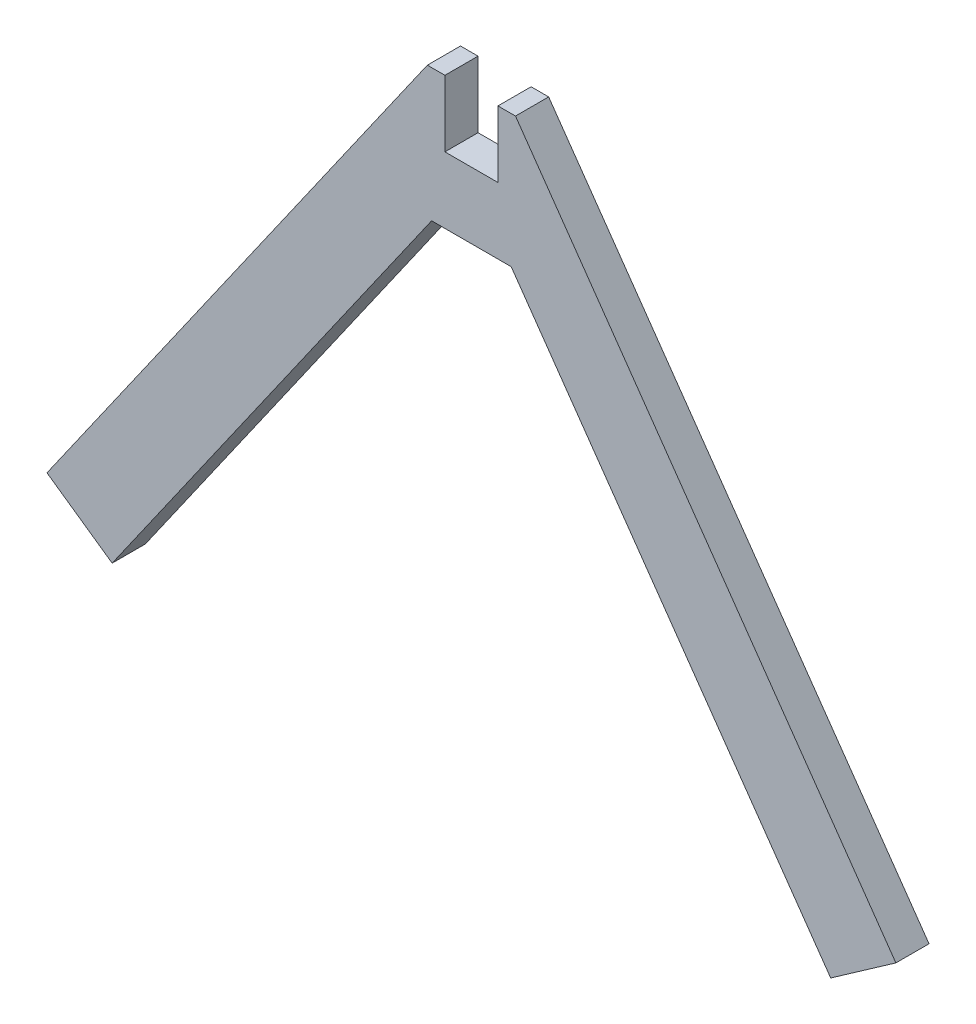
ISO-10303-21;
HEADER;
FILE_DESCRIPTION(('STEP AP214'),'2;1');
FILE_NAME('part.step','',(''),(''),'','','');
FILE_SCHEMA(('AUTOMOTIVE_DESIGN { 1 0 10303 214 1 1 1 1 }'));
ENDSEC;
DATA;
#1=APPLICATION_CONTEXT('core data for automotive mechanical design processes');
#2=APPLICATION_PROTOCOL_DEFINITION('international standard','automotive_design',2000,#1);
#3=PRODUCT_CONTEXT('',#1,'mechanical');
#4=PRODUCT('Part','Part','',(#3));
#5=PRODUCT_RELATED_PRODUCT_CATEGORY('part','',(#4));
#6=PRODUCT_DEFINITION_FORMATION('','',#4);
#7=PRODUCT_DEFINITION_CONTEXT('part definition',#1,'design');
#8=PRODUCT_DEFINITION('design','',#6,#7);
#9=PRODUCT_DEFINITION_SHAPE('','',#8);
#10=(LENGTH_UNIT() NAMED_UNIT(*) SI_UNIT(.MILLI.,.METRE.));
#11=(NAMED_UNIT(*) PLANE_ANGLE_UNIT() SI_UNIT($,.RADIAN.));
#12=(NAMED_UNIT(*) SI_UNIT($,.STERADIAN.) SOLID_ANGLE_UNIT());
#13=UNCERTAINTY_MEASURE_WITH_UNIT(LENGTH_MEASURE(1.E-05),#10,'distance_accuracy_value','');
#14=(GEOMETRIC_REPRESENTATION_CONTEXT(3) GLOBAL_UNCERTAINTY_ASSIGNED_CONTEXT((#13)) GLOBAL_UNIT_ASSIGNED_CONTEXT((#10,
#11,#12)) REPRESENTATION_CONTEXT('',''));
#15=CARTESIAN_POINT('',(0.,0.,0.));
#16=DIRECTION('',(0.,0.,1.));
#17=DIRECTION('',(1.,0.,0.));
#18=AXIS2_PLACEMENT_3D('',#15,#16,#17);
#19=CARTESIAN_POINT('',(4.21966663109892,0.,3.175));
#20=DIRECTION('',(0.,-1.,0.));
#21=DIRECTION('',(1.,0.,0.));
#22=AXIS2_PLACEMENT_3D('',#19,#20,#21);
#23=PLANE('',#22);
#24=DIRECTION('',(-1.,0.,0.));
#25=VECTOR('',#24,1.);
#26=CARTESIAN_POINT('',(4.21966663109892,0.,0.));
#27=LINE('',#26,#25);
#28=CARTESIAN_POINT('',(4.21966663109892,0.,0.));
#29=VERTEX_POINT('',#28);
#30=CARTESIAN_POINT('',(2.54,0.,0.));
#31=VERTEX_POINT('',#30);
#32=EDGE_CURVE('E154',#29,#31,#27,.T.);
#33=ORIENTED_EDGE('',*,*,#32,.T.);
#34=DIRECTION('',(0.,0.,1.));
#35=VECTOR('',#34,1.);
#36=CARTESIAN_POINT('',(2.54,0.,-0.00100000000000013));
#37=LINE('',#36,#35);
#38=CARTESIAN_POINT('',(2.54,0.,3.175));
#39=VERTEX_POINT('',#38);
#40=EDGE_CURVE('E192',#31,#39,#37,.T.);
#41=ORIENTED_EDGE('',*,*,#40,.T.);
#42=DIRECTION('',(-1.,0.,0.));
#43=VECTOR('',#42,1.);
#44=CARTESIAN_POINT('',(4.21966663109892,0.,3.175));
#45=LINE('',#44,#43);
#46=CARTESIAN_POINT('',(4.21966663109892,0.,3.175));
#47=VERTEX_POINT('',#46);
#48=EDGE_CURVE('E238',#47,#39,#45,.T.);
#49=ORIENTED_EDGE('',*,*,#48,.F.);
#50=DIRECTION('',(0.,0.,-1.));
#51=VECTOR('',#50,1.);
#52=CARTESIAN_POINT('',(4.21966663109892,0.,3.175));
#53=LINE('',#52,#51);
#54=EDGE_CURVE('E170',#47,#29,#53,.T.);
#55=ORIENTED_EDGE('',*,*,#54,.T.);
#56=EDGE_LOOP('',(#33,#41,#49,#55));
#57=FACE_BOUND('',#56,.T.);
#58=ADVANCED_FACE('F36',(#57),#23,.F.);
#59=CARTESIAN_POINT('',(34.3998317619085,-56.3868072573458,3.175));
#60=DIRECTION('',(0.819152044288989,0.57357643635105,0.));
#61=DIRECTION('',(-0.57357643635105,0.819152044288989,0.));
#62=AXIS2_PLACEMENT_3D('',#59,#60,#61);
#63=PLANE('',#62);
#64=DIRECTION('',(0.57357643635105,-0.819152044288989,0.));
#65=VECTOR('',#64,1.);
#66=CARTESIAN_POINT('',(34.3998317619085,-56.3868072573458,0.));
#67=LINE('',#66,#65);
#68=CARTESIAN_POINT('',(3.81000000000001,-12.7,0.));
#69=VERTEX_POINT('',#68);
#70=CARTESIAN_POINT('',(34.3998317619085,-56.3868072573458,0.));
#71=VERTEX_POINT('',#70);
#72=EDGE_CURVE('E145',#69,#71,#67,.T.);
#73=ORIENTED_EDGE('',*,*,#72,.T.);
#74=DIRECTION('',(0.,0.,-1.));
#75=VECTOR('',#74,1.);
#76=CARTESIAN_POINT('',(34.3998317619085,-56.3868072573458,3.175));
#77=LINE('',#76,#75);
#78=CARTESIAN_POINT('',(34.3998317619085,-56.3868072573458,3.175));
#79=VERTEX_POINT('',#78);
#80=EDGE_CURVE('E11',#79,#71,#77,.T.);
#81=ORIENTED_EDGE('',*,*,#80,.F.);
#82=DIRECTION('',(0.57357643635105,-0.819152044288989,0.));
#83=VECTOR('',#82,1.);
#84=CARTESIAN_POINT('',(34.3998317619085,-56.3868072573458,3.175));
#85=LINE('',#84,#83);
#86=CARTESIAN_POINT('',(3.81000000000001,-12.7,3.175));
#87=VERTEX_POINT('',#86);
#88=EDGE_CURVE('E163',#87,#79,#85,.T.);
#89=ORIENTED_EDGE('',*,*,#88,.F.);
#90=DIRECTION('',(0.,0.,-1.));
#91=VECTOR('',#90,1.);
#92=CARTESIAN_POINT('',(3.81000000000001,-12.7,3.175));
#93=LINE('',#92,#91);
#94=EDGE_CURVE('E141',#87,#69,#93,.T.);
#95=ORIENTED_EDGE('',*,*,#94,.T.);
#96=EDGE_LOOP('',(#73,#81,#89,#95));
#97=FACE_BOUND('',#96,.T.);
#98=ADVANCED_FACE('F38',(#97),#63,.F.);
#99=CARTESIAN_POINT('',(40.6417703393906,-52.0161548123508,3.175));
#100=DIRECTION('',(-0.57357643635105,0.819152044288989,0.));
#101=DIRECTION('',(-0.819152044288989,-0.57357643635105,0.));
#102=AXIS2_PLACEMENT_3D('',#99,#100,#101);
#103=PLANE('',#102);
#104=DIRECTION('',(0.819152044288989,0.57357643635105,0.));
#105=VECTOR('',#104,1.);
#106=CARTESIAN_POINT('',(40.6417703393906,-52.0161548123508,0.));
#107=LINE('',#106,#105);
#108=CARTESIAN_POINT('',(40.6417703393906,-52.0161548123508,0.));
#109=VERTEX_POINT('',#108);
#110=EDGE_CURVE('E148',#71,#109,#107,.T.);
#111=ORIENTED_EDGE('',*,*,#110,.T.);
#112=DIRECTION('',(0.,0.,-1.));
#113=VECTOR('',#112,1.);
#114=CARTESIAN_POINT('',(40.6417703393906,-52.0161548123508,3.175));
#115=LINE('',#114,#113);
#116=CARTESIAN_POINT('',(40.6417703393906,-52.0161548123508,3.175));
#117=VERTEX_POINT('',#116);
#118=EDGE_CURVE('E44',#117,#109,#115,.T.);
#119=ORIENTED_EDGE('',*,*,#118,.F.);
#120=DIRECTION('',(0.819152044288989,0.57357643635105,0.));
#121=VECTOR('',#120,1.);
#122=CARTESIAN_POINT('',(40.6417703393906,-52.0161548123508,3.175));
#123=LINE('',#122,#121);
#124=EDGE_CURVE('E101',#79,#117,#123,.T.);
#125=ORIENTED_EDGE('',*,*,#124,.F.);
#126=ORIENTED_EDGE('',*,*,#80,.T.);
#127=EDGE_LOOP('',(#111,#119,#125,#126));
#128=FACE_BOUND('',#127,.T.);
#129=ADVANCED_FACE('F251',(#128),#103,.F.);
#130=CARTESIAN_POINT('',(4.21966663109892,0.,3.175));
#131=DIRECTION('',(-0.819152044288989,-0.57357643635105,0.));
#132=DIRECTION('',(0.57357643635105,-0.819152044288989,0.));
#133=AXIS2_PLACEMENT_3D('',#130,#131,#132);
#134=PLANE('',#133);
#135=DIRECTION('',(-0.57357643635105,0.819152044288989,0.));
#136=VECTOR('',#135,1.);
#137=CARTESIAN_POINT('',(4.21966663109892,0.,0.));
#138=LINE('',#137,#136);
#139=EDGE_CURVE('E151',#109,#29,#138,.T.);
#140=ORIENTED_EDGE('',*,*,#139,.T.);
#141=ORIENTED_EDGE('',*,*,#54,.F.);
#142=DIRECTION('',(-0.57357643635105,0.819152044288989,0.));
#143=VECTOR('',#142,1.);
#144=CARTESIAN_POINT('',(4.21966663109892,0.,3.175));
#145=LINE('',#144,#143);
#146=EDGE_CURVE('E178',#117,#47,#145,.T.);
#147=ORIENTED_EDGE('',*,*,#146,.F.);
#148=ORIENTED_EDGE('',*,*,#118,.T.);
#149=EDGE_LOOP('',(#140,#141,#147,#148));
#150=FACE_BOUND('',#149,.T.);
#151=ADVANCED_FACE('F176',(#150),#134,.F.);
#152=CARTESIAN_POINT('',(-2.54,0.,3.175));
#153=VERTEX_POINT('',#152);
#154=CARTESIAN_POINT('',(-4.21966663109891,0.,3.175));
#155=VERTEX_POINT('',#154);
#156=EDGE_CURVE('E237',#153,#155,#45,.T.);
#157=ORIENTED_EDGE('',*,*,#156,.F.);
#158=DIRECTION('',(0.,0.,1.));
#159=VECTOR('',#158,1.);
#160=CARTESIAN_POINT('',(-2.54,0.,-0.00100000000000013));
#161=LINE('',#160,#159);
#162=CARTESIAN_POINT('',(-2.54,0.,0.));
#163=VERTEX_POINT('',#162);
#164=EDGE_CURVE('E231',#163,#153,#161,.T.);
#165=ORIENTED_EDGE('',*,*,#164,.F.);
#166=CARTESIAN_POINT('',(-4.21966663109891,0.,0.));
#167=VERTEX_POINT('',#166);
#168=EDGE_CURVE('E153',#163,#167,#27,.T.);
#169=ORIENTED_EDGE('',*,*,#168,.T.);
#170=DIRECTION('',(0.,0.,-1.));
#171=VECTOR('',#170,1.);
#172=CARTESIAN_POINT('',(-4.21966663109891,0.,3.175));
#173=LINE('',#172,#171);
#174=EDGE_CURVE('E167',#155,#167,#173,.T.);
#175=ORIENTED_EDGE('',*,*,#174,.F.);
#176=EDGE_LOOP('',(#157,#165,#169,#175));
#177=FACE_BOUND('',#176,.T.);
#178=ADVANCED_FACE('F243',(#177),#23,.F.);
#179=CARTESIAN_POINT('',(-4.21966663109891,0.,3.175));
#180=DIRECTION('',(0.819152044288989,-0.57357643635105,0.));
#181=DIRECTION('',(0.57357643635105,0.819152044288989,0.));
#182=AXIS2_PLACEMENT_3D('',#179,#180,#181);
#183=PLANE('',#182);
#184=DIRECTION('',(-0.57357643635105,-0.819152044288989,0.));
#185=VECTOR('',#184,1.);
#186=CARTESIAN_POINT('',(-4.21966663109891,0.,0.));
#187=LINE('',#186,#185);
#188=CARTESIAN_POINT('',(-40.6417703393906,-52.0161548123508,0.));
#189=VERTEX_POINT('',#188);
#190=EDGE_CURVE('E157',#167,#189,#187,.T.);
#191=ORIENTED_EDGE('',*,*,#190,.T.);
#192=DIRECTION('',(0.,0.,-1.));
#193=VECTOR('',#192,1.);
#194=CARTESIAN_POINT('',(-40.6417703393906,-52.0161548123508,3.175));
#195=LINE('',#194,#193);
#196=CARTESIAN_POINT('',(-40.6417703393906,-52.0161548123508,3.175));
#197=VERTEX_POINT('',#196);
#198=EDGE_CURVE('E136',#197,#189,#195,.T.);
#199=ORIENTED_EDGE('',*,*,#198,.F.);
#200=DIRECTION('',(-0.57357643635105,-0.819152044288989,0.));
#201=VECTOR('',#200,1.);
#202=CARTESIAN_POINT('',(-4.21966663109891,0.,3.175));
#203=LINE('',#202,#201);
#204=EDGE_CURVE('E124',#155,#197,#203,.T.);
#205=ORIENTED_EDGE('',*,*,#204,.F.);
#206=ORIENTED_EDGE('',*,*,#174,.T.);
#207=EDGE_LOOP('',(#191,#199,#205,#206));
#208=FACE_BOUND('',#207,.T.);
#209=ADVANCED_FACE('F246',(#208),#183,.F.);
#210=CARTESIAN_POINT('',(-40.6417703393906,-52.0161548123508,3.175));
#211=DIRECTION('',(0.57357643635105,0.819152044288989,0.));
#212=DIRECTION('',(-0.819152044288989,0.57357643635105,0.));
#213=AXIS2_PLACEMENT_3D('',#210,#211,#212);
#214=PLANE('',#213);
#215=DIRECTION('',(0.819152044288989,-0.57357643635105,0.));
#216=VECTOR('',#215,1.);
#217=CARTESIAN_POINT('',(-40.6417703393906,-52.0161548123508,0.));
#218=LINE('',#217,#216);
#219=CARTESIAN_POINT('',(-34.3998317619085,-56.3868072573458,0.));
#220=VERTEX_POINT('',#219);
#221=EDGE_CURVE('E133',#189,#220,#218,.T.);
#222=ORIENTED_EDGE('',*,*,#221,.T.);
#223=DIRECTION('',(0.,0.,-1.));
#224=VECTOR('',#223,1.);
#225=CARTESIAN_POINT('',(-34.3998317619085,-56.3868072573458,3.175));
#226=LINE('',#225,#224);
#227=CARTESIAN_POINT('',(-34.3998317619085,-56.3868072573458,3.175));
#228=VERTEX_POINT('',#227);
#229=EDGE_CURVE('E130',#228,#220,#226,.T.);
#230=ORIENTED_EDGE('',*,*,#229,.F.);
#231=DIRECTION('',(0.819152044288989,-0.57357643635105,0.));
#232=VECTOR('',#231,1.);
#233=CARTESIAN_POINT('',(-40.6417703393906,-52.0161548123508,3.175));
#234=LINE('',#233,#232);
#235=EDGE_CURVE('E116',#197,#228,#234,.T.);
#236=ORIENTED_EDGE('',*,*,#235,.F.);
#237=ORIENTED_EDGE('',*,*,#198,.T.);
#238=EDGE_LOOP('',(#222,#230,#236,#237));
#239=FACE_BOUND('',#238,.T.);
#240=ADVANCED_FACE('F131',(#239),#214,.F.);
#241=CARTESIAN_POINT('',(-34.3998317619085,-56.3868072573458,3.175));
#242=DIRECTION('',(-0.819152044288989,0.57357643635105,0.));
#243=DIRECTION('',(-0.57357643635105,-0.819152044288989,0.));
#244=AXIS2_PLACEMENT_3D('',#241,#242,#243);
#245=PLANE('',#244);
#246=DIRECTION('',(0.57357643635105,0.819152044288989,0.));
#247=VECTOR('',#246,1.);
#248=CARTESIAN_POINT('',(-34.3998317619085,-56.3868072573458,0.));
#249=LINE('',#248,#247);
#250=CARTESIAN_POINT('',(-3.80999999999999,-12.7,0.));
#251=VERTEX_POINT('',#250);
#252=EDGE_CURVE('E160',#220,#251,#249,.T.);
#253=ORIENTED_EDGE('',*,*,#252,.T.);
#254=DIRECTION('',(0.,0.,-1.));
#255=VECTOR('',#254,1.);
#256=CARTESIAN_POINT('',(-3.80999999999999,-12.7,3.175));
#257=LINE('',#256,#255);
#258=CARTESIAN_POINT('',(-3.80999999999999,-12.7,3.175));
#259=VERTEX_POINT('',#258);
#260=EDGE_CURVE('E137',#259,#251,#257,.T.);
#261=ORIENTED_EDGE('',*,*,#260,.F.);
#262=DIRECTION('',(0.57357643635105,0.819152044288989,0.));
#263=VECTOR('',#262,1.);
#264=CARTESIAN_POINT('',(-34.3998317619085,-56.3868072573458,3.175));
#265=LINE('',#264,#263);
#266=EDGE_CURVE('E121',#228,#259,#265,.T.);
#267=ORIENTED_EDGE('',*,*,#266,.F.);
#268=ORIENTED_EDGE('',*,*,#229,.T.);
#269=EDGE_LOOP('',(#253,#261,#267,#268));
#270=FACE_BOUND('',#269,.T.);
#271=ADVANCED_FACE('F139',(#270),#245,.F.);
#272=CARTESIAN_POINT('',(-3.80999999999999,-12.7,3.175));
#273=DIRECTION('',(0.,1.,0.));
#274=DIRECTION('',(-1.,0.,0.));
#275=AXIS2_PLACEMENT_3D('',#272,#273,#274);
#276=PLANE('',#275);
#277=DIRECTION('',(1.,0.,0.));
#278=VECTOR('',#277,1.);
#279=CARTESIAN_POINT('',(-3.80999999999999,-12.7,0.));
#280=LINE('',#279,#278);
#281=EDGE_CURVE('E93',#251,#69,#280,.T.);
#282=ORIENTED_EDGE('',*,*,#281,.T.);
#283=ORIENTED_EDGE('',*,*,#94,.F.);
#284=DIRECTION('',(1.,0.,0.));
#285=VECTOR('',#284,1.);
#286=CARTESIAN_POINT('',(-3.80999999999999,-12.7,3.175));
#287=LINE('',#286,#285);
#288=EDGE_CURVE('E60',#259,#87,#287,.T.);
#289=ORIENTED_EDGE('',*,*,#288,.F.);
#290=ORIENTED_EDGE('',*,*,#260,.T.);
#291=EDGE_LOOP('',(#282,#283,#289,#290));
#292=FACE_BOUND('',#291,.T.);
#293=ADVANCED_FACE('F247',(#292),#276,.F.);
#294=CARTESIAN_POINT('',(0.,0.,3.175));
#295=DIRECTION('',(0.,0.,1.));
#296=DIRECTION('',(1.,0.,0.));
#297=AXIS2_PLACEMENT_3D('',#294,#295,#296);
#298=PLANE('',#297);
#299=DIRECTION('',(0.,1.,0.));
#300=VECTOR('',#299,1.);
#301=CARTESIAN_POINT('',(2.54,0.,3.175));
#302=LINE('',#301,#300);
#303=CARTESIAN_POINT('',(2.54,-6.35,3.175));
#304=VERTEX_POINT('',#303);
#305=EDGE_CURVE('E219',#304,#39,#302,.T.);
#306=ORIENTED_EDGE('',*,*,#305,.F.);
#307=DIRECTION('',(1.,0.,0.));
#308=VECTOR('',#307,1.);
#309=CARTESIAN_POINT('',(-2.54,-6.35,3.175));
#310=LINE('',#309,#308);
#311=CARTESIAN_POINT('',(-2.54,-6.35,3.175));
#312=VERTEX_POINT('',#311);
#313=EDGE_CURVE('E215',#312,#304,#310,.T.);
#314=ORIENTED_EDGE('',*,*,#313,.F.);
#315=DIRECTION('',(0.,-1.,0.));
#316=VECTOR('',#315,1.);
#317=CARTESIAN_POINT('',(-2.54,0.,3.175));
#318=LINE('',#317,#316);
#319=EDGE_CURVE('E226',#153,#312,#318,.T.);
#320=ORIENTED_EDGE('',*,*,#319,.F.);
#321=ORIENTED_EDGE('',*,*,#156,.T.);
#322=ORIENTED_EDGE('',*,*,#204,.T.);
#323=ORIENTED_EDGE('',*,*,#235,.T.);
#324=ORIENTED_EDGE('',*,*,#266,.T.);
#325=ORIENTED_EDGE('',*,*,#288,.T.);
#326=ORIENTED_EDGE('',*,*,#88,.T.);
#327=ORIENTED_EDGE('',*,*,#124,.T.);
#328=ORIENTED_EDGE('',*,*,#146,.T.);
#329=ORIENTED_EDGE('',*,*,#48,.T.);
#330=EDGE_LOOP('',(#306,#314,#320,#321,#322,#323,#324,#325,#326,#327,#328,#329));
#331=FACE_BOUND('',#330,.T.);
#332=ADVANCED_FACE('F119',(#331),#298,.T.);
#333=CARTESIAN_POINT('',(0.,0.,0.));
#334=DIRECTION('',(0.,0.,1.));
#335=DIRECTION('',(1.,0.,0.));
#336=AXIS2_PLACEMENT_3D('',#333,#334,#335);
#337=PLANE('',#336);
#338=DIRECTION('',(-1.,0.,0.));
#339=VECTOR('',#338,1.);
#340=CARTESIAN_POINT('',(-2.54,-6.35,0.));
#341=LINE('',#340,#339);
#342=CARTESIAN_POINT('',(2.54,-6.35,0.));
#343=VERTEX_POINT('',#342);
#344=CARTESIAN_POINT('',(-2.54,-6.35,0.));
#345=VERTEX_POINT('',#344);
#346=EDGE_CURVE('E51',#343,#345,#341,.T.);
#347=ORIENTED_EDGE('',*,*,#346,.F.);
#348=DIRECTION('',(0.,-1.,0.));
#349=VECTOR('',#348,1.);
#350=CARTESIAN_POINT('',(2.54,0.,0.));
#351=LINE('',#350,#349);
#352=EDGE_CURVE('E186',#31,#343,#351,.T.);
#353=ORIENTED_EDGE('',*,*,#352,.F.);
#354=ORIENTED_EDGE('',*,*,#32,.F.);
#355=ORIENTED_EDGE('',*,*,#139,.F.);
#356=ORIENTED_EDGE('',*,*,#110,.F.);
#357=ORIENTED_EDGE('',*,*,#72,.F.);
#358=ORIENTED_EDGE('',*,*,#281,.F.);
#359=ORIENTED_EDGE('',*,*,#252,.F.);
#360=ORIENTED_EDGE('',*,*,#221,.F.);
#361=ORIENTED_EDGE('',*,*,#190,.F.);
#362=ORIENTED_EDGE('',*,*,#168,.F.);
#363=DIRECTION('',(0.,1.,0.));
#364=VECTOR('',#363,1.);
#365=CARTESIAN_POINT('',(-2.54,0.,0.));
#366=LINE('',#365,#364);
#367=EDGE_CURVE('E210',#345,#163,#366,.T.);
#368=ORIENTED_EDGE('',*,*,#367,.F.);
#369=EDGE_LOOP('',(#347,#353,#354,#355,#356,#357,#358,#359,#360,#361,#362,#368));
#370=FACE_BOUND('',#369,.T.);
#371=ADVANCED_FACE('F181',(#370),#337,.F.);
#372=CARTESIAN_POINT('',(2.54,0.,-0.00100000000000013));
#373=DIRECTION('',(1.,0.,0.));
#374=DIRECTION('',(0.,0.,-1.));
#375=AXIS2_PLACEMENT_3D('',#372,#373,#374);
#376=PLANE('',#375);
#377=ORIENTED_EDGE('',*,*,#352,.T.);
#378=DIRECTION('',(0.,0.,1.));
#379=VECTOR('',#378,1.);
#380=CARTESIAN_POINT('',(2.54,-6.35,-0.00100000000000013));
#381=LINE('',#380,#379);
#382=EDGE_CURVE('E149',#343,#304,#381,.T.);
#383=ORIENTED_EDGE('',*,*,#382,.T.);
#384=ORIENTED_EDGE('',*,*,#305,.T.);
#385=ORIENTED_EDGE('',*,*,#40,.F.);
#386=EDGE_LOOP('',(#377,#383,#384,#385));
#387=FACE_BOUND('',#386,.T.);
#388=ADVANCED_FACE('F218',(#387),#376,.F.);
#389=CARTESIAN_POINT('',(-2.54,-6.35,-0.00100000000000013));
#390=DIRECTION('',(0.,-1.,0.));
#391=DIRECTION('',(1.,0.,0.));
#392=AXIS2_PLACEMENT_3D('',#389,#390,#391);
#393=PLANE('',#392);
#394=ORIENTED_EDGE('',*,*,#346,.T.);
#395=DIRECTION('',(0.,0.,1.));
#396=VECTOR('',#395,1.);
#397=CARTESIAN_POINT('',(-2.54,-6.35,-0.00100000000000013));
#398=LINE('',#397,#396);
#399=EDGE_CURVE('E216',#345,#312,#398,.T.);
#400=ORIENTED_EDGE('',*,*,#399,.T.);
#401=ORIENTED_EDGE('',*,*,#313,.T.);
#402=ORIENTED_EDGE('',*,*,#382,.F.);
#403=EDGE_LOOP('',(#394,#400,#401,#402));
#404=FACE_BOUND('',#403,.T.);
#405=ADVANCED_FACE('F213',(#404),#393,.F.);
#406=CARTESIAN_POINT('',(-2.54,0.,-0.00100000000000013));
#407=DIRECTION('',(-1.,0.,0.));
#408=DIRECTION('',(0.,-1.,0.));
#409=AXIS2_PLACEMENT_3D('',#406,#407,#408);
#410=PLANE('',#409);
#411=ORIENTED_EDGE('',*,*,#367,.T.);
#412=ORIENTED_EDGE('',*,*,#164,.T.);
#413=ORIENTED_EDGE('',*,*,#319,.T.);
#414=ORIENTED_EDGE('',*,*,#399,.F.);
#415=EDGE_LOOP('',(#411,#412,#413,#414));
#416=FACE_BOUND('',#415,.T.);
#417=ADVANCED_FACE('F282',(#416),#410,.F.);
#418=CLOSED_SHELL('',(#58,#98,#129,#151,#178,#209,#240,#271,#293,#332,#371,#388,#405,#417));
#419=MANIFOLD_SOLID_BREP('B2',#418);
#420=ADVANCED_BREP_SHAPE_REPRESENTATION('',(#18,#419),#14);
#421=SHAPE_DEFINITION_REPRESENTATION(#9,#420);
ENDSEC;
END-ISO-10303-21;
